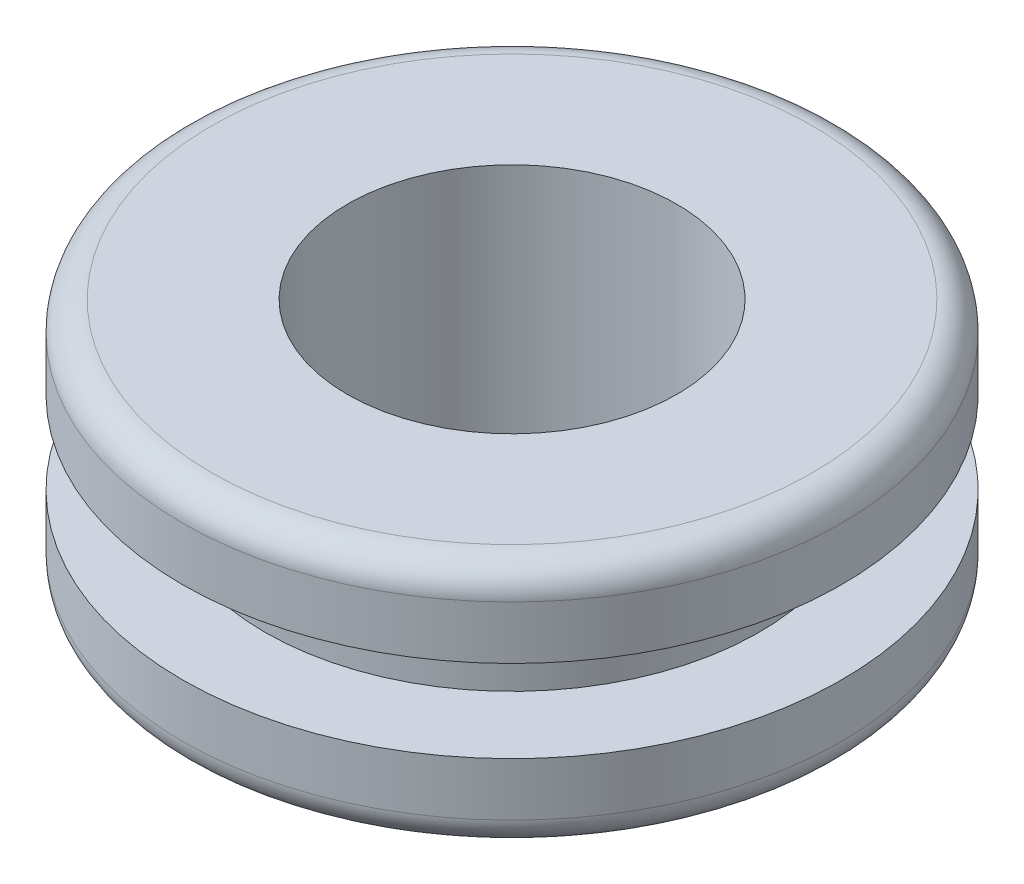
ISO-10303-21;
HEADER;
FILE_DESCRIPTION(('STEP AP214'),'2;1');
FILE_NAME('part.step','',(''),(''),'','','');
FILE_SCHEMA(('AUTOMOTIVE_DESIGN { 1 0 10303 214 1 1 1 1 }'));
ENDSEC;
DATA;
#1=APPLICATION_CONTEXT('core data for automotive mechanical design processes');
#2=APPLICATION_PROTOCOL_DEFINITION('international standard','automotive_design',2000,#1);
#3=PRODUCT_CONTEXT('',#1,'mechanical');
#4=PRODUCT('Part','Part','',(#3));
#5=PRODUCT_RELATED_PRODUCT_CATEGORY('part','',(#4));
#6=PRODUCT_DEFINITION_FORMATION('','',#4);
#7=PRODUCT_DEFINITION_CONTEXT('part definition',#1,'design');
#8=PRODUCT_DEFINITION('design','',#6,#7);
#9=PRODUCT_DEFINITION_SHAPE('','',#8);
#10=(LENGTH_UNIT() NAMED_UNIT(*) SI_UNIT(.MILLI.,.METRE.));
#11=(NAMED_UNIT(*) PLANE_ANGLE_UNIT() SI_UNIT($,.RADIAN.));
#12=(NAMED_UNIT(*) SI_UNIT($,.STERADIAN.) SOLID_ANGLE_UNIT());
#13=UNCERTAINTY_MEASURE_WITH_UNIT(LENGTH_MEASURE(1.E-05),#10,'distance_accuracy_value','');
#14=(GEOMETRIC_REPRESENTATION_CONTEXT(3) GLOBAL_UNCERTAINTY_ASSIGNED_CONTEXT((#13)) GLOBAL_UNIT_ASSIGNED_CONTEXT((#10,
#11,#12)) REPRESENTATION_CONTEXT('',''));
#15=CARTESIAN_POINT('',(0.,0.,0.));
#16=DIRECTION('',(0.,0.,1.));
#17=DIRECTION('',(1.,0.,0.));
#18=AXIS2_PLACEMENT_3D('',#15,#16,#17);
#19=CARTESIAN_POINT('',(0.,1.81998399243315,0.));
#20=DIRECTION('',(0.,1.,0.));
#21=DIRECTION('',(0.,0.,1.));
#22=AXIS2_PLACEMENT_3D('',#19,#20,#21);
#23=TOROIDAL_SURFACE('',#22,5.78873399243318,0.561266007566819);
#24=CARTESIAN_POINT('',(0.,1.81998399243315,0.));
#25=DIRECTION('',(0.,1.,0.));
#26=DIRECTION('',(0.,0.,1.));
#27=AXIS2_PLACEMENT_3D('',#24,#25,#26);
#28=CIRCLE('',#27,6.34999999999999);
#29=CARTESIAN_POINT('',(0.,1.81998399243315,6.34999999999999));
#30=VERTEX_POINT('',#29);
#31=EDGE_CURVE('E10',#30,#30,#28,.T.);
#32=ORIENTED_EDGE('',*,*,#31,.T.);
#33=EDGE_LOOP('',(#32));
#34=FACE_BOUND('',#33,.T.);
#35=CARTESIAN_POINT('',(0.,2.38124999999997,0.));
#36=DIRECTION('',(0.,1.,0.));
#37=DIRECTION('',(0.,0.,1.));
#38=AXIS2_PLACEMENT_3D('',#35,#36,#37);
#39=CIRCLE('',#38,5.78873399243318);
#40=CARTESIAN_POINT('',(0.,2.38124999999997,5.78873399243318));
#41=VERTEX_POINT('',#40);
#42=EDGE_CURVE('E75',#41,#41,#39,.T.);
#43=ORIENTED_EDGE('',*,*,#42,.F.);
#44=EDGE_LOOP('',(#43));
#45=FACE_BOUND('',#44,.T.);
#46=ADVANCED_FACE('F41',(#34,#45),#23,.T.);
#47=CARTESIAN_POINT('',(0.,-2.38125000000002,0.));
#48=DIRECTION('',(0.,1.,0.));
#49=DIRECTION('',(0.,0.,1.));
#50=AXIS2_PLACEMENT_3D('',#47,#48,#49);
#51=CYLINDRICAL_SURFACE('',#50,6.34999999999999);
#52=CARTESIAN_POINT('',(0.,0.79375000000006,0.));
#53=DIRECTION('',(0.,1.,0.));
#54=DIRECTION('',(0.,0.,1.));
#55=AXIS2_PLACEMENT_3D('',#52,#53,#54);
#56=CIRCLE('',#55,6.34999999999999);
#57=CARTESIAN_POINT('',(0.,0.79375000000006,6.34999999999999));
#58=VERTEX_POINT('',#57);
#59=EDGE_CURVE('E47',#58,#58,#56,.T.);
#60=ORIENTED_EDGE('',*,*,#59,.T.);
#61=EDGE_LOOP('',(#60));
#62=FACE_BOUND('',#61,.T.);
#63=ORIENTED_EDGE('',*,*,#31,.F.);
#64=EDGE_LOOP('',(#63));
#65=FACE_BOUND('',#64,.T.);
#66=ADVANCED_FACE('F83',(#62,#65),#51,.T.);
#67=CARTESIAN_POINT('',(-6.34999999999999,0.79375000000006,0.));
#68=DIRECTION('',(0.,-1.,0.));
#69=DIRECTION('',(0.,0.,-1.));
#70=AXIS2_PLACEMENT_3D('',#67,#68,#69);
#71=PLANE('',#70);
#72=CARTESIAN_POINT('',(0.,0.793750000000061,0.));
#73=DIRECTION('',(0.,1.,0.));
#74=DIRECTION('',(0.,0.,1.));
#75=AXIS2_PLACEMENT_3D('',#72,#73,#74);
#76=CIRCLE('',#75,4.7625);
#77=CARTESIAN_POINT('',(0.,0.793750000000061,4.7625));
#78=VERTEX_POINT('',#77);
#79=EDGE_CURVE('E51',#78,#78,#76,.T.);
#80=ORIENTED_EDGE('',*,*,#79,.T.);
#81=EDGE_LOOP('',(#80));
#82=FACE_BOUND('',#81,.T.);
#83=ORIENTED_EDGE('',*,*,#59,.F.);
#84=EDGE_LOOP('',(#83));
#85=FACE_BOUND('',#84,.T.);
#86=ADVANCED_FACE('F87',(#82,#85),#71,.T.);
#87=CARTESIAN_POINT('',(0.,-2.38125000000002,0.));
#88=DIRECTION('',(0.,1.,0.));
#89=DIRECTION('',(0.,0.,1.));
#90=AXIS2_PLACEMENT_3D('',#87,#88,#89);
#91=CYLINDRICAL_SURFACE('',#90,4.7625);
#92=CARTESIAN_POINT('',(0.,-0.793749999999962,0.));
#93=DIRECTION('',(0.,1.,0.));
#94=DIRECTION('',(0.,0.,1.));
#95=AXIS2_PLACEMENT_3D('',#92,#93,#94);
#96=CIRCLE('',#95,4.7625);
#97=CARTESIAN_POINT('',(0.,-0.793749999999962,4.7625));
#98=VERTEX_POINT('',#97);
#99=EDGE_CURVE('E55',#98,#98,#96,.T.);
#100=ORIENTED_EDGE('',*,*,#99,.T.);
#101=EDGE_LOOP('',(#100));
#102=FACE_BOUND('',#101,.T.);
#103=ORIENTED_EDGE('',*,*,#79,.F.);
#104=EDGE_LOOP('',(#103));
#105=FACE_BOUND('',#104,.T.);
#106=ADVANCED_FACE('F91',(#102,#105),#91,.T.);
#107=CARTESIAN_POINT('',(-4.7625,-0.793749999999962,0.));
#108=DIRECTION('',(0.,1.,0.));
#109=DIRECTION('',(0.,0.,1.));
#110=AXIS2_PLACEMENT_3D('',#107,#108,#109);
#111=PLANE('',#110);
#112=CARTESIAN_POINT('',(0.,-0.793749999999962,0.));
#113=DIRECTION('',(0.,1.,0.));
#114=DIRECTION('',(0.,0.,1.));
#115=AXIS2_PLACEMENT_3D('',#112,#113,#114);
#116=CIRCLE('',#115,6.34999999999999);
#117=CARTESIAN_POINT('',(0.,-0.793749999999962,6.34999999999999));
#118=VERTEX_POINT('',#117);
#119=EDGE_CURVE('E60',#118,#118,#116,.T.);
#120=ORIENTED_EDGE('',*,*,#119,.T.);
#121=EDGE_LOOP('',(#120));
#122=FACE_BOUND('',#121,.T.);
#123=ORIENTED_EDGE('',*,*,#99,.F.);
#124=EDGE_LOOP('',(#123));
#125=FACE_BOUND('',#124,.T.);
#126=ADVANCED_FACE('F98',(#122,#125),#111,.T.);
#127=CARTESIAN_POINT('',(0.,-2.38125000000002,0.));
#128=DIRECTION('',(0.,1.,0.));
#129=DIRECTION('',(0.,0.,1.));
#130=AXIS2_PLACEMENT_3D('',#127,#128,#129);
#131=CYLINDRICAL_SURFACE('',#130,6.35);
#132=CARTESIAN_POINT('',(0.,-1.81998399243305,0.));
#133=DIRECTION('',(0.,1.,0.));
#134=DIRECTION('',(0.,0.,1.));
#135=AXIS2_PLACEMENT_3D('',#132,#133,#134);
#136=CIRCLE('',#135,6.35);
#137=CARTESIAN_POINT('',(0.,-1.81998399243305,6.35));
#138=VERTEX_POINT('',#137);
#139=EDGE_CURVE('E63',#138,#138,#136,.T.);
#140=ORIENTED_EDGE('',*,*,#139,.T.);
#141=EDGE_LOOP('',(#140));
#142=FACE_BOUND('',#141,.T.);
#143=ORIENTED_EDGE('',*,*,#119,.F.);
#144=EDGE_LOOP('',(#143));
#145=FACE_BOUND('',#144,.T.);
#146=ADVANCED_FACE('F102',(#142,#145),#131,.T.);
#147=CARTESIAN_POINT('',(0.,-1.81998399243311,0.));
#148=DIRECTION('',(0.,1.,0.));
#149=DIRECTION('',(0.,0.,1.));
#150=AXIS2_PLACEMENT_3D('',#147,#148,#149);
#151=TOROIDAL_SURFACE('',#150,5.78873399243318,0.561266007566818);
#152=CARTESIAN_POINT('',(0.,-2.38124999999993,0.));
#153=DIRECTION('',(0.,1.,0.));
#154=DIRECTION('',(0.,0.,1.));
#155=AXIS2_PLACEMENT_3D('',#152,#153,#154);
#156=CIRCLE('',#155,5.78873399243318);
#157=CARTESIAN_POINT('',(0.,-2.38124999999993,5.78873399243318));
#158=VERTEX_POINT('',#157);
#159=EDGE_CURVE('E66',#158,#158,#156,.T.);
#160=ORIENTED_EDGE('',*,*,#159,.T.);
#161=EDGE_LOOP('',(#160));
#162=FACE_BOUND('',#161,.T.);
#163=ORIENTED_EDGE('',*,*,#139,.F.);
#164=EDGE_LOOP('',(#163));
#165=FACE_BOUND('',#164,.T.);
#166=ADVANCED_FACE('F106',(#162,#165),#151,.T.);
#167=CARTESIAN_POINT('',(-5.78873399243318,-2.38124999999993,0.));
#168=DIRECTION('',(0.,-1.,0.));
#169=DIRECTION('',(0.,0.,-1.));
#170=AXIS2_PLACEMENT_3D('',#167,#168,#169);
#171=PLANE('',#170);
#172=CARTESIAN_POINT('',(0.,-2.38124999999993,0.));
#173=DIRECTION('',(0.,1.,0.));
#174=DIRECTION('',(0.,0.,1.));
#175=AXIS2_PLACEMENT_3D('',#172,#173,#174);
#176=CIRCLE('',#175,3.17500000000001);
#177=CARTESIAN_POINT('',(0.,-2.38124999999993,3.17500000000001));
#178=VERTEX_POINT('',#177);
#179=EDGE_CURVE('E69',#178,#178,#176,.T.);
#180=ORIENTED_EDGE('',*,*,#179,.T.);
#181=EDGE_LOOP('',(#180));
#182=FACE_BOUND('',#181,.T.);
#183=ORIENTED_EDGE('',*,*,#159,.F.);
#184=EDGE_LOOP('',(#183));
#185=FACE_BOUND('',#184,.T.);
#186=ADVANCED_FACE('F110',(#182,#185),#171,.T.);
#187=CARTESIAN_POINT('',(0.,-2.38125000000002,0.));
#188=DIRECTION('',(0.,1.,0.));
#189=DIRECTION('',(0.,0.,1.));
#190=AXIS2_PLACEMENT_3D('',#187,#188,#189);
#191=CYLINDRICAL_SURFACE('',#190,3.17500000000001);
#192=CARTESIAN_POINT('',(0.,2.38124999999997,0.));
#193=DIRECTION('',(0.,1.,0.));
#194=DIRECTION('',(0.,0.,1.));
#195=AXIS2_PLACEMENT_3D('',#192,#193,#194);
#196=CIRCLE('',#195,3.17500000000001);
#197=CARTESIAN_POINT('',(0.,2.38124999999997,3.17500000000001));
#198=VERTEX_POINT('',#197);
#199=EDGE_CURVE('E72',#198,#198,#196,.T.);
#200=ORIENTED_EDGE('',*,*,#199,.T.);
#201=EDGE_LOOP('',(#200));
#202=FACE_BOUND('',#201,.T.);
#203=ORIENTED_EDGE('',*,*,#179,.F.);
#204=EDGE_LOOP('',(#203));
#205=FACE_BOUND('',#204,.T.);
#206=ADVANCED_FACE('F114',(#202,#205),#191,.F.);
#207=CARTESIAN_POINT('',(-3.17500000000001,2.38124999999997,0.));
#208=DIRECTION('',(0.,1.,0.));
#209=DIRECTION('',(0.,0.,1.));
#210=AXIS2_PLACEMENT_3D('',#207,#208,#209);
#211=PLANE('',#210);
#212=ORIENTED_EDGE('',*,*,#42,.T.);
#213=EDGE_LOOP('',(#212));
#214=FACE_BOUND('',#213,.T.);
#215=ORIENTED_EDGE('',*,*,#199,.F.);
#216=EDGE_LOOP('',(#215));
#217=FACE_BOUND('',#216,.T.);
#218=ADVANCED_FACE('F79',(#214,#217),#211,.T.);
#219=CLOSED_SHELL('',(#46,#66,#86,#106,#126,#146,#166,#186,#206,#218));
#220=MANIFOLD_SOLID_BREP('B2',#219);
#221=ADVANCED_BREP_SHAPE_REPRESENTATION('',(#18,#220),#14);
#222=SHAPE_DEFINITION_REPRESENTATION(#9,#221);
ENDSEC;
END-ISO-10303-21;
